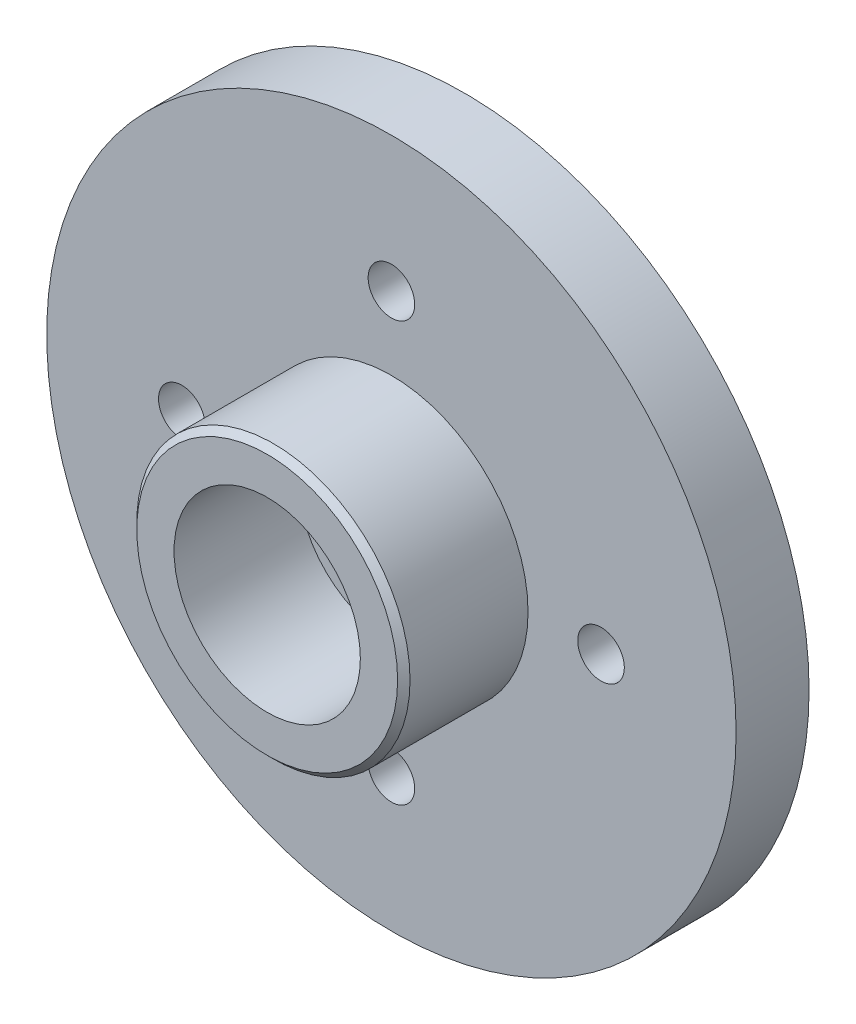
ISO-10303-21;
HEADER;
FILE_DESCRIPTION(('STEP AP214'),'2;1');
FILE_NAME('part.step','',(''),(''),'','','');
FILE_SCHEMA(('AUTOMOTIVE_DESIGN { 1 0 10303 214 1 1 1 1 }'));
ENDSEC;
DATA;
#1=APPLICATION_CONTEXT('core data for automotive mechanical design processes');
#2=APPLICATION_PROTOCOL_DEFINITION('international standard','automotive_design',2000,#1);
#3=PRODUCT_CONTEXT('',#1,'mechanical');
#4=PRODUCT('Part','Part','',(#3));
#5=PRODUCT_RELATED_PRODUCT_CATEGORY('part','',(#4));
#6=PRODUCT_DEFINITION_FORMATION('','',#4);
#7=PRODUCT_DEFINITION_CONTEXT('part definition',#1,'design');
#8=PRODUCT_DEFINITION('design','',#6,#7);
#9=PRODUCT_DEFINITION_SHAPE('','',#8);
#10=(LENGTH_UNIT() NAMED_UNIT(*) SI_UNIT(.MILLI.,.METRE.));
#11=(NAMED_UNIT(*) PLANE_ANGLE_UNIT() SI_UNIT($,.RADIAN.));
#12=(NAMED_UNIT(*) SI_UNIT($,.STERADIAN.) SOLID_ANGLE_UNIT());
#13=UNCERTAINTY_MEASURE_WITH_UNIT(LENGTH_MEASURE(1.E-05),#10,'distance_accuracy_value','');
#14=(GEOMETRIC_REPRESENTATION_CONTEXT(3) GLOBAL_UNCERTAINTY_ASSIGNED_CONTEXT((#13)) GLOBAL_UNIT_ASSIGNED_CONTEXT((#10,
#11,#12)) REPRESENTATION_CONTEXT('',''));
#15=CARTESIAN_POINT('',(0.,0.,0.));
#16=DIRECTION('',(0.,0.,1.));
#17=DIRECTION('',(1.,0.,0.));
#18=AXIS2_PLACEMENT_3D('',#15,#16,#17);
#19=CARTESIAN_POINT('',(0.,0.,2.35));
#20=DIRECTION('',(0.,0.,1.));
#21=DIRECTION('',(1.,0.,0.));
#22=AXIS2_PLACEMENT_3D('',#19,#20,#21);
#23=PLANE('',#22);
#24=CARTESIAN_POINT('',(0.,0.,2.35));
#25=DIRECTION('',(0.,0.,1.));
#26=DIRECTION('',(1.,0.,0.));
#27=AXIS2_PLACEMENT_3D('',#24,#25,#26);
#28=CIRCLE('',#27,4.4);
#29=CARTESIAN_POINT('',(4.4,0.,2.35));
#30=VERTEX_POINT('',#29);
#31=EDGE_CURVE('E71',#30,#30,#28,.T.);
#32=ORIENTED_EDGE('',*,*,#31,.F.);
#33=EDGE_LOOP('',(#32));
#34=FACE_BOUND('',#33,.T.);
#35=CARTESIAN_POINT('',(0.,0.,2.35));
#36=DIRECTION('',(0.,0.,1.));
#37=DIRECTION('',(1.,0.,0.));
#38=AXIS2_PLACEMENT_3D('',#35,#36,#37);
#39=CIRCLE('',#38,11.1);
#40=CARTESIAN_POINT('',(11.1,0.,2.35));
#41=VERTEX_POINT('',#40);
#42=EDGE_CURVE('E58',#41,#41,#39,.T.);
#43=ORIENTED_EDGE('',*,*,#42,.T.);
#44=EDGE_LOOP('',(#43));
#45=FACE_BOUND('',#44,.T.);
#46=CARTESIAN_POINT('',(-6.75,0.,2.35));
#47=DIRECTION('',(0.,0.,1.));
#48=DIRECTION('',(1.,0.,0.));
#49=AXIS2_PLACEMENT_3D('',#46,#47,#48);
#50=CIRCLE('',#49,0.749999999999999);
#51=CARTESIAN_POINT('',(-6.,0.,2.35));
#52=VERTEX_POINT('',#51);
#53=EDGE_CURVE('E85',#52,#52,#50,.T.);
#54=ORIENTED_EDGE('',*,*,#53,.F.);
#55=EDGE_LOOP('',(#54));
#56=FACE_BOUND('',#55,.T.);
#57=CARTESIAN_POINT('',(0.,-6.75,2.35));
#58=DIRECTION('',(0.,0.,1.));
#59=DIRECTION('',(1.,0.,0.));
#60=AXIS2_PLACEMENT_3D('',#57,#58,#59);
#61=CIRCLE('',#60,0.75);
#62=CARTESIAN_POINT('',(0.75,-6.75,2.35));
#63=VERTEX_POINT('',#62);
#64=EDGE_CURVE('E93',#63,#63,#61,.T.);
#65=ORIENTED_EDGE('',*,*,#64,.F.);
#66=EDGE_LOOP('',(#65));
#67=FACE_BOUND('',#66,.T.);
#68=CARTESIAN_POINT('',(6.75,0.,2.35));
#69=DIRECTION('',(0.,0.,1.));
#70=DIRECTION('',(1.,0.,0.));
#71=AXIS2_PLACEMENT_3D('',#68,#69,#70);
#72=CIRCLE('',#71,0.749999999999999);
#73=CARTESIAN_POINT('',(7.5,0.,2.35));
#74=VERTEX_POINT('',#73);
#75=EDGE_CURVE('E101',#74,#74,#72,.T.);
#76=ORIENTED_EDGE('',*,*,#75,.F.);
#77=EDGE_LOOP('',(#76));
#78=FACE_BOUND('',#77,.T.);
#79=CARTESIAN_POINT('',(0.,6.75,2.35));
#80=DIRECTION('',(0.,0.,1.));
#81=DIRECTION('',(1.,0.,0.));
#82=AXIS2_PLACEMENT_3D('',#79,#80,#81);
#83=CIRCLE('',#82,0.75);
#84=CARTESIAN_POINT('',(0.75,6.75,2.35));
#85=VERTEX_POINT('',#84);
#86=EDGE_CURVE('E109',#85,#85,#83,.T.);
#87=ORIENTED_EDGE('',*,*,#86,.F.);
#88=EDGE_LOOP('',(#87));
#89=FACE_BOUND('',#88,.T.);
#90=ADVANCED_FACE('F39',(#34,#45,#56,#67,#78,#89),#23,.T.);
#91=CARTESIAN_POINT('',(0.,0.,0.));
#92=DIRECTION('',(0.,0.,1.));
#93=DIRECTION('',(1.,0.,0.));
#94=AXIS2_PLACEMENT_3D('',#91,#92,#93);
#95=PLANE('',#94);
#96=CARTESIAN_POINT('',(0.,0.,0.));
#97=DIRECTION('',(0.,0.,1.));
#98=DIRECTION('',(1.,0.,0.));
#99=AXIS2_PLACEMENT_3D('',#96,#97,#98);
#100=CIRCLE('',#99,1.43);
#101=CARTESIAN_POINT('',(1.43,0.,0.));
#102=VERTEX_POINT('',#101);
#103=EDGE_CURVE('E61',#102,#102,#100,.T.);
#104=ORIENTED_EDGE('',*,*,#103,.T.);
#105=EDGE_LOOP('',(#104));
#106=FACE_BOUND('',#105,.T.);
#107=CARTESIAN_POINT('',(0.,0.,0.));
#108=DIRECTION('',(0.,0.,1.));
#109=DIRECTION('',(1.,0.,0.));
#110=AXIS2_PLACEMENT_3D('',#107,#108,#109);
#111=CIRCLE('',#110,11.1);
#112=CARTESIAN_POINT('',(11.1,0.,0.));
#113=VERTEX_POINT('',#112);
#114=EDGE_CURVE('E67',#113,#113,#111,.T.);
#115=ORIENTED_EDGE('',*,*,#114,.F.);
#116=EDGE_LOOP('',(#115));
#117=FACE_BOUND('',#116,.T.);
#118=CARTESIAN_POINT('',(-6.75,0.,0.));
#119=DIRECTION('',(0.,0.,1.));
#120=DIRECTION('',(1.,0.,0.));
#121=AXIS2_PLACEMENT_3D('',#118,#119,#120);
#122=CIRCLE('',#121,0.749999999999999);
#123=CARTESIAN_POINT('',(-6.,0.,0.));
#124=VERTEX_POINT('',#123);
#125=EDGE_CURVE('E84',#124,#124,#122,.T.);
#126=ORIENTED_EDGE('',*,*,#125,.T.);
#127=EDGE_LOOP('',(#126));
#128=FACE_BOUND('',#127,.T.);
#129=CARTESIAN_POINT('',(0.,-6.75,0.));
#130=DIRECTION('',(0.,0.,1.));
#131=DIRECTION('',(1.,0.,0.));
#132=AXIS2_PLACEMENT_3D('',#129,#130,#131);
#133=CIRCLE('',#132,0.75);
#134=CARTESIAN_POINT('',(0.75,-6.75,0.));
#135=VERTEX_POINT('',#134);
#136=EDGE_CURVE('E89',#135,#135,#133,.T.);
#137=ORIENTED_EDGE('',*,*,#136,.T.);
#138=EDGE_LOOP('',(#137));
#139=FACE_BOUND('',#138,.T.);
#140=CARTESIAN_POINT('',(6.75,0.,0.));
#141=DIRECTION('',(0.,0.,1.));
#142=DIRECTION('',(1.,0.,0.));
#143=AXIS2_PLACEMENT_3D('',#140,#141,#142);
#144=CIRCLE('',#143,0.749999999999999);
#145=CARTESIAN_POINT('',(7.5,0.,0.));
#146=VERTEX_POINT('',#145);
#147=EDGE_CURVE('E97',#146,#146,#144,.T.);
#148=ORIENTED_EDGE('',*,*,#147,.T.);
#149=EDGE_LOOP('',(#148));
#150=FACE_BOUND('',#149,.T.);
#151=CARTESIAN_POINT('',(0.,6.75,0.));
#152=DIRECTION('',(0.,0.,1.));
#153=DIRECTION('',(1.,0.,0.));
#154=AXIS2_PLACEMENT_3D('',#151,#152,#153);
#155=CIRCLE('',#154,0.75);
#156=CARTESIAN_POINT('',(0.75,6.75,0.));
#157=VERTEX_POINT('',#156);
#158=EDGE_CURVE('E105',#157,#157,#155,.T.);
#159=ORIENTED_EDGE('',*,*,#158,.T.);
#160=EDGE_LOOP('',(#159));
#161=FACE_BOUND('',#160,.T.);
#162=ADVANCED_FACE('F117',(#106,#117,#128,#139,#150,#161),#95,.F.);
#163=CARTESIAN_POINT('',(0.,0.,2.35));
#164=DIRECTION('',(0.,0.,-1.));
#165=DIRECTION('',(-1.,0.,0.));
#166=AXIS2_PLACEMENT_3D('',#163,#164,#165);
#167=CYLINDRICAL_SURFACE('',#166,11.1);
#168=ORIENTED_EDGE('',*,*,#42,.F.);
#169=EDGE_LOOP('',(#168));
#170=FACE_BOUND('',#169,.T.);
#171=ORIENTED_EDGE('',*,*,#114,.T.);
#172=EDGE_LOOP('',(#171));
#173=FACE_BOUND('',#172,.T.);
#174=ADVANCED_FACE('F133',(#170,#173),#167,.T.);
#175=CARTESIAN_POINT('',(0.,0.,6.35));
#176=DIRECTION('',(0.,0.,1.));
#177=DIRECTION('',(1.,0.,0.));
#178=AXIS2_PLACEMENT_3D('',#175,#176,#177);
#179=PLANE('',#178);
#180=CARTESIAN_POINT('',(0.,0.,6.35));
#181=DIRECTION('',(0.,0.,1.));
#182=DIRECTION('',(1.,0.,0.));
#183=AXIS2_PLACEMENT_3D('',#180,#181,#182);
#184=CIRCLE('',#183,4.2);
#185=CARTESIAN_POINT('',(4.2,0.,6.35));
#186=VERTEX_POINT('',#185);
#187=EDGE_CURVE('E48',#186,#186,#184,.T.);
#188=ORIENTED_EDGE('',*,*,#187,.T.);
#189=EDGE_LOOP('',(#188));
#190=FACE_BOUND('',#189,.T.);
#191=CARTESIAN_POINT('',(0.,0.,6.35));
#192=DIRECTION('',(0.,0.,1.));
#193=DIRECTION('',(1.,0.,0.));
#194=AXIS2_PLACEMENT_3D('',#191,#192,#193);
#195=CIRCLE('',#194,3.);
#196=CARTESIAN_POINT('',(3.,0.,6.35));
#197=VERTEX_POINT('',#196);
#198=EDGE_CURVE('E64',#197,#197,#195,.T.);
#199=ORIENTED_EDGE('',*,*,#198,.F.);
#200=EDGE_LOOP('',(#199));
#201=FACE_BOUND('',#200,.T.);
#202=ADVANCED_FACE('F183',(#190,#201),#179,.T.);
#203=CARTESIAN_POINT('',(0.,0.,6.35));
#204=DIRECTION('',(0.,0.,-1.));
#205=DIRECTION('',(-1.,0.,0.));
#206=AXIS2_PLACEMENT_3D('',#203,#204,#205);
#207=CYLINDRICAL_SURFACE('',#206,4.4);
#208=CARTESIAN_POINT('',(0.,0.,6.15));
#209=DIRECTION('',(0.,0.,1.));
#210=DIRECTION('',(1.,0.,0.));
#211=AXIS2_PLACEMENT_3D('',#208,#209,#210);
#212=CIRCLE('',#211,4.4);
#213=CARTESIAN_POINT('',(4.4,0.,6.15));
#214=VERTEX_POINT('',#213);
#215=EDGE_CURVE('E10',#214,#214,#212,.F.);
#216=ORIENTED_EDGE('',*,*,#215,.T.);
#217=EDGE_LOOP('',(#216));
#218=FACE_BOUND('',#217,.T.);
#219=ORIENTED_EDGE('',*,*,#31,.T.);
#220=EDGE_LOOP('',(#219));
#221=FACE_BOUND('',#220,.T.);
#222=ADVANCED_FACE('F149',(#218,#221),#207,.T.);
#223=CARTESIAN_POINT('',(0.,0.,6.35));
#224=DIRECTION('',(0.,0.,-1.));
#225=DIRECTION('',(-1.,0.,0.));
#226=AXIS2_PLACEMENT_3D('',#223,#224,#225);
#227=CYLINDRICAL_SURFACE('',#226,3.);
#228=ORIENTED_EDGE('',*,*,#198,.T.);
#229=EDGE_LOOP('',(#228));
#230=FACE_BOUND('',#229,.T.);
#231=CARTESIAN_POINT('',(0.,0.,2.35));
#232=DIRECTION('',(0.,0.,1.));
#233=DIRECTION('',(1.,0.,0.));
#234=AXIS2_PLACEMENT_3D('',#231,#232,#233);
#235=CIRCLE('',#234,3.);
#236=CARTESIAN_POINT('',(3.,0.,2.35));
#237=VERTEX_POINT('',#236);
#238=EDGE_CURVE('E53',#237,#237,#235,.F.);
#239=ORIENTED_EDGE('',*,*,#238,.T.);
#240=EDGE_LOOP('',(#239));
#241=FACE_BOUND('',#240,.T.);
#242=ADVANCED_FACE('F141',(#230,#241),#227,.F.);
#243=CARTESIAN_POINT('',(0.,0.,2.35));
#244=DIRECTION('',(0.,0.,1.));
#245=DIRECTION('',(1.,0.,0.));
#246=AXIS2_PLACEMENT_3D('',#243,#244,#245);
#247=CIRCLE('',#246,1.43);
#248=CARTESIAN_POINT('',(1.43,0.,2.35));
#249=VERTEX_POINT('',#248);
#250=EDGE_CURVE('E65',#249,#249,#247,.T.);
#251=ORIENTED_EDGE('',*,*,#250,.F.);
#252=EDGE_LOOP('',(#251));
#253=FACE_BOUND('',#252,.T.);
#254=ORIENTED_EDGE('',*,*,#238,.F.);
#255=EDGE_LOOP('',(#254));
#256=FACE_BOUND('',#255,.T.);
#257=ADVANCED_FACE('F129',(#253,#256),#23,.T.);
#258=CARTESIAN_POINT('',(0.,0.,-1.65));
#259=DIRECTION('',(0.,0.,1.));
#260=DIRECTION('',(1.,0.,0.));
#261=AXIS2_PLACEMENT_3D('',#258,#259,#260);
#262=CYLINDRICAL_SURFACE('',#261,1.43);
#263=ORIENTED_EDGE('',*,*,#250,.T.);
#264=EDGE_LOOP('',(#263));
#265=FACE_BOUND('',#264,.T.);
#266=ORIENTED_EDGE('',*,*,#103,.F.);
#267=EDGE_LOOP('',(#266));
#268=FACE_BOUND('',#267,.T.);
#269=ADVANCED_FACE('F140',(#265,#268),#262,.F.);
#270=CARTESIAN_POINT('',(0.,0.,6.35));
#271=DIRECTION('',(0.,0.,-1.));
#272=DIRECTION('',(-1.,0.,0.));
#273=AXIS2_PLACEMENT_3D('',#270,#271,#272);
#274=CONICAL_SURFACE('',#273,4.2,0.785398163397433);
#275=ORIENTED_EDGE('',*,*,#215,.F.);
#276=EDGE_LOOP('',(#275));
#277=FACE_BOUND('',#276,.T.);
#278=ORIENTED_EDGE('',*,*,#187,.F.);
#279=EDGE_LOOP('',(#278));
#280=FACE_BOUND('',#279,.T.);
#281=ADVANCED_FACE('F42',(#277,#280),#274,.T.);
#282=CARTESIAN_POINT('',(-6.75,0.,0.));
#283=DIRECTION('',(0.,0.,1.));
#284=DIRECTION('',(1.,0.,0.));
#285=AXIS2_PLACEMENT_3D('',#282,#283,#284);
#286=CYLINDRICAL_SURFACE('',#285,0.749999999999999);
#287=ORIENTED_EDGE('',*,*,#125,.F.);
#288=EDGE_LOOP('',(#287));
#289=FACE_BOUND('',#288,.T.);
#290=ORIENTED_EDGE('',*,*,#53,.T.);
#291=EDGE_LOOP('',(#290));
#292=FACE_BOUND('',#291,.T.);
#293=ADVANCED_FACE('F176',(#289,#292),#286,.F.);
#294=CARTESIAN_POINT('',(0.,-6.75,0.));
#295=DIRECTION('',(0.,0.,1.));
#296=DIRECTION('',(1.,0.,0.));
#297=AXIS2_PLACEMENT_3D('',#294,#295,#296);
#298=CYLINDRICAL_SURFACE('',#297,0.75);
#299=ORIENTED_EDGE('',*,*,#136,.F.);
#300=EDGE_LOOP('',(#299));
#301=FACE_BOUND('',#300,.T.);
#302=ORIENTED_EDGE('',*,*,#64,.T.);
#303=EDGE_LOOP('',(#302));
#304=FACE_BOUND('',#303,.T.);
#305=ADVANCED_FACE('F169',(#301,#304),#298,.F.);
#306=CARTESIAN_POINT('',(6.75,0.,0.));
#307=DIRECTION('',(0.,0.,1.));
#308=DIRECTION('',(1.,0.,0.));
#309=AXIS2_PLACEMENT_3D('',#306,#307,#308);
#310=CYLINDRICAL_SURFACE('',#309,0.749999999999999);
#311=ORIENTED_EDGE('',*,*,#147,.F.);
#312=EDGE_LOOP('',(#311));
#313=FACE_BOUND('',#312,.T.);
#314=ORIENTED_EDGE('',*,*,#75,.T.);
#315=EDGE_LOOP('',(#314));
#316=FACE_BOUND('',#315,.T.);
#317=ADVANCED_FACE('F122',(#313,#316),#310,.F.);
#318=CARTESIAN_POINT('',(0.,6.75,0.));
#319=DIRECTION('',(0.,0.,1.));
#320=DIRECTION('',(1.,0.,0.));
#321=AXIS2_PLACEMENT_3D('',#318,#319,#320);
#322=CYLINDRICAL_SURFACE('',#321,0.75);
#323=ORIENTED_EDGE('',*,*,#158,.F.);
#324=EDGE_LOOP('',(#323));
#325=FACE_BOUND('',#324,.T.);
#326=ORIENTED_EDGE('',*,*,#86,.T.);
#327=EDGE_LOOP('',(#326));
#328=FACE_BOUND('',#327,.T.);
#329=ADVANCED_FACE('F119',(#325,#328),#322,.F.);
#330=CLOSED_SHELL('',(#90,#162,#174,#202,#222,#242,#257,#269,#281,#293,#305,#317,#329));
#331=MANIFOLD_SOLID_BREP('B2',#330);
#332=ADVANCED_BREP_SHAPE_REPRESENTATION('',(#18,#331),#14);
#333=SHAPE_DEFINITION_REPRESENTATION(#9,#332);
ENDSEC;
END-ISO-10303-21;
